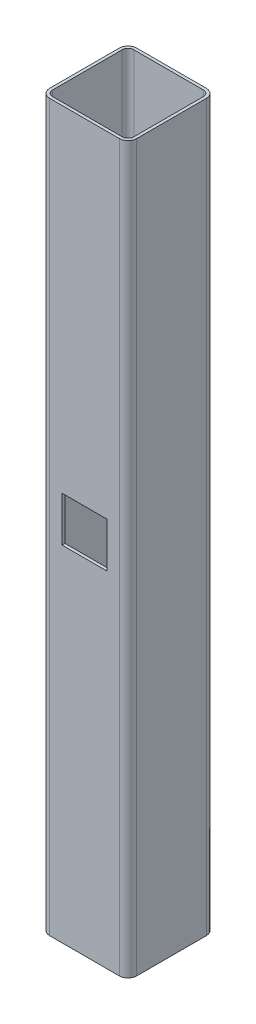
ISO-10303-21;
HEADER;
FILE_DESCRIPTION(('STEP AP214'),'2;1');
FILE_NAME('part.step','',(''),(''),'','','');
FILE_SCHEMA(('AUTOMOTIVE_DESIGN { 1 0 10303 214 1 1 1 1 }'));
ENDSEC;
DATA;
#1=APPLICATION_CONTEXT('core data for automotive mechanical design processes');
#2=APPLICATION_PROTOCOL_DEFINITION('international standard','automotive_design',2000,#1);
#3=PRODUCT_CONTEXT('',#1,'mechanical');
#4=PRODUCT('Part','Part','',(#3));
#5=PRODUCT_RELATED_PRODUCT_CATEGORY('part','',(#4));
#6=PRODUCT_DEFINITION_FORMATION('','',#4);
#7=PRODUCT_DEFINITION_CONTEXT('part definition',#1,'design');
#8=PRODUCT_DEFINITION('design','',#6,#7);
#9=PRODUCT_DEFINITION_SHAPE('','',#8);
#10=(LENGTH_UNIT() NAMED_UNIT(*) SI_UNIT(.MILLI.,.METRE.));
#11=(NAMED_UNIT(*) PLANE_ANGLE_UNIT() SI_UNIT($,.RADIAN.));
#12=(NAMED_UNIT(*) SI_UNIT($,.STERADIAN.) SOLID_ANGLE_UNIT());
#13=UNCERTAINTY_MEASURE_WITH_UNIT(LENGTH_MEASURE(1.E-05),#10,'distance_accuracy_value','');
#14=(GEOMETRIC_REPRESENTATION_CONTEXT(3) GLOBAL_UNCERTAINTY_ASSIGNED_CONTEXT((#13)) GLOBAL_UNIT_ASSIGNED_CONTEXT((#10,
#11,#12)) REPRESENTATION_CONTEXT('',''));
#15=CARTESIAN_POINT('',(0.,0.,0.));
#16=DIRECTION('',(0.,0.,1.));
#17=DIRECTION('',(1.,0.,0.));
#18=AXIS2_PLACEMENT_3D('',#15,#16,#17);
#19=CARTESIAN_POINT('',(24.,250.,24.));
#20=DIRECTION('',(0.,-1.,0.));
#21=DIRECTION('',(0.,0.,-1.));
#22=AXIS2_PLACEMENT_3D('',#19,#20,#21);
#23=PLANE('',#22);
#24=CARTESIAN_POINT('',(24.,250.,24.));
#25=DIRECTION('',(0.,1.,0.));
#26=DIRECTION('',(0.,0.,-1.));
#27=AXIS2_PLACEMENT_3D('',#24,#25,#26);
#28=CIRCLE('',#27,6.);
#29=CARTESIAN_POINT('',(24.,250.,30.));
#30=VERTEX_POINT('',#29);
#31=CARTESIAN_POINT('',(30.,250.,24.));
#32=VERTEX_POINT('',#31);
#33=EDGE_CURVE('E322',#30,#32,#28,.T.);
#34=ORIENTED_EDGE('',*,*,#33,.T.);
#35=DIRECTION('',(0.,0.,-1.));
#36=VECTOR('',#35,1.);
#37=CARTESIAN_POINT('',(30.,250.,24.));
#38=LINE('',#37,#36);
#39=CARTESIAN_POINT('',(30.,250.,-24.));
#40=VERTEX_POINT('',#39);
#41=EDGE_CURVE('E325',#32,#40,#38,.T.);
#42=ORIENTED_EDGE('',*,*,#41,.T.);
#43=CARTESIAN_POINT('',(24.,250.,-24.));
#44=DIRECTION('',(0.,1.,0.));
#45=DIRECTION('',(0.,0.,1.));
#46=AXIS2_PLACEMENT_3D('',#43,#44,#45);
#47=CIRCLE('',#46,6.);
#48=CARTESIAN_POINT('',(24.,250.,-30.));
#49=VERTEX_POINT('',#48);
#50=EDGE_CURVE('E328',#40,#49,#47,.T.);
#51=ORIENTED_EDGE('',*,*,#50,.T.);
#52=DIRECTION('',(-1.,0.,0.));
#53=VECTOR('',#52,1.);
#54=CARTESIAN_POINT('',(-24.,250.,-30.));
#55=LINE('',#54,#53);
#56=CARTESIAN_POINT('',(-24.,250.,-30.));
#57=VERTEX_POINT('',#56);
#58=EDGE_CURVE('E330',#49,#57,#55,.T.);
#59=ORIENTED_EDGE('',*,*,#58,.T.);
#60=CARTESIAN_POINT('',(-24.,250.,-24.));
#61=DIRECTION('',(0.,1.,0.));
#62=DIRECTION('',(0.,0.,1.));
#63=AXIS2_PLACEMENT_3D('',#60,#61,#62);
#64=CIRCLE('',#63,6.);
#65=CARTESIAN_POINT('',(-30.,250.,-24.));
#66=VERTEX_POINT('',#65);
#67=EDGE_CURVE('E332',#57,#66,#64,.T.);
#68=ORIENTED_EDGE('',*,*,#67,.T.);
#69=DIRECTION('',(0.,0.,1.));
#70=VECTOR('',#69,1.);
#71=CARTESIAN_POINT('',(-30.,250.,24.));
#72=LINE('',#71,#70);
#73=CARTESIAN_POINT('',(-30.,250.,24.));
#74=VERTEX_POINT('',#73);
#75=EDGE_CURVE('E334',#66,#74,#72,.T.);
#76=ORIENTED_EDGE('',*,*,#75,.T.);
#77=CARTESIAN_POINT('',(-24.,250.,24.));
#78=DIRECTION('',(0.,1.,0.));
#79=DIRECTION('',(0.,0.,-1.));
#80=AXIS2_PLACEMENT_3D('',#77,#78,#79);
#81=CIRCLE('',#80,6.);
#82=CARTESIAN_POINT('',(-24.,250.,30.));
#83=VERTEX_POINT('',#82);
#84=EDGE_CURVE('E336',#74,#83,#81,.T.);
#85=ORIENTED_EDGE('',*,*,#84,.T.);
#86=DIRECTION('',(1.,0.,0.));
#87=VECTOR('',#86,1.);
#88=CARTESIAN_POINT('',(-24.,250.,30.));
#89=LINE('',#88,#87);
#90=EDGE_CURVE('E338',#83,#30,#89,.T.);
#91=ORIENTED_EDGE('',*,*,#90,.T.);
#92=EDGE_LOOP('',(#34,#42,#51,#59,#68,#76,#85,#91));
#93=FACE_BOUND('',#92,.T.);
#94=CARTESIAN_POINT('',(24.,250.,24.));
#95=DIRECTION('',(0.,-1.,0.));
#96=DIRECTION('',(0.,0.,-1.));
#97=AXIS2_PLACEMENT_3D('',#94,#95,#96);
#98=CIRCLE('',#97,4.);
#99=CARTESIAN_POINT('',(24.,250.,28.));
#100=VERTEX_POINT('',#99);
#101=CARTESIAN_POINT('',(28.,250.,24.));
#102=VERTEX_POINT('',#101);
#103=EDGE_CURVE('E289',#100,#102,#98,.F.);
#104=ORIENTED_EDGE('',*,*,#103,.F.);
#105=DIRECTION('',(1.,0.,0.));
#106=VECTOR('',#105,1.);
#107=CARTESIAN_POINT('',(24.,250.,28.));
#108=LINE('',#107,#106);
#109=CARTESIAN_POINT('',(-24.,250.,28.));
#110=VERTEX_POINT('',#109);
#111=EDGE_CURVE('E271',#110,#100,#108,.T.);
#112=ORIENTED_EDGE('',*,*,#111,.F.);
#113=CARTESIAN_POINT('',(-24.,250.,24.));
#114=DIRECTION('',(0.,-1.,0.));
#115=DIRECTION('',(0.,0.,-1.));
#116=AXIS2_PLACEMENT_3D('',#113,#114,#115);
#117=CIRCLE('',#116,4.);
#118=CARTESIAN_POINT('',(-28.,250.,24.));
#119=VERTEX_POINT('',#118);
#120=EDGE_CURVE('E318',#119,#110,#117,.F.);
#121=ORIENTED_EDGE('',*,*,#120,.F.);
#122=DIRECTION('',(0.,0.,1.));
#123=VECTOR('',#122,1.);
#124=CARTESIAN_POINT('',(-28.,250.,24.));
#125=LINE('',#124,#123);
#126=CARTESIAN_POINT('',(-28.,250.,-24.));
#127=VERTEX_POINT('',#126);
#128=EDGE_CURVE('E316',#127,#119,#125,.T.);
#129=ORIENTED_EDGE('',*,*,#128,.F.);
#130=CARTESIAN_POINT('',(-24.,250.,-24.));
#131=DIRECTION('',(0.,-1.,0.));
#132=DIRECTION('',(0.,0.,-1.));
#133=AXIS2_PLACEMENT_3D('',#130,#131,#132);
#134=CIRCLE('',#133,4.);
#135=CARTESIAN_POINT('',(-24.,250.,-28.));
#136=VERTEX_POINT('',#135);
#137=EDGE_CURVE('E314',#136,#127,#134,.F.);
#138=ORIENTED_EDGE('',*,*,#137,.F.);
#139=DIRECTION('',(-1.,0.,0.));
#140=VECTOR('',#139,1.);
#141=CARTESIAN_POINT('',(24.,250.,-28.));
#142=LINE('',#141,#140);
#143=CARTESIAN_POINT('',(24.,250.,-28.));
#144=VERTEX_POINT('',#143);
#145=EDGE_CURVE('E312',#144,#136,#142,.T.);
#146=ORIENTED_EDGE('',*,*,#145,.F.);
#147=CARTESIAN_POINT('',(24.,250.,-24.));
#148=DIRECTION('',(0.,-1.,0.));
#149=DIRECTION('',(0.,0.,-1.));
#150=AXIS2_PLACEMENT_3D('',#147,#148,#149);
#151=CIRCLE('',#150,4.);
#152=CARTESIAN_POINT('',(28.,250.,-24.));
#153=VERTEX_POINT('',#152);
#154=EDGE_CURVE('E310',#153,#144,#151,.F.);
#155=ORIENTED_EDGE('',*,*,#154,.F.);
#156=DIRECTION('',(0.,0.,-1.));
#157=VECTOR('',#156,1.);
#158=CARTESIAN_POINT('',(28.,250.,24.));
#159=LINE('',#158,#157);
#160=EDGE_CURVE('E308',#102,#153,#159,.T.);
#161=ORIENTED_EDGE('',*,*,#160,.F.);
#162=EDGE_LOOP('',(#104,#112,#121,#129,#138,#146,#155,#161));
#163=FACE_BOUND('',#162,.T.);
#164=ADVANCED_FACE('F46',(#93,#163),#23,.F.);
#165=CARTESIAN_POINT('',(24.,-250.,24.));
#166=DIRECTION('',(0.,-1.,0.));
#167=DIRECTION('',(0.,0.,-1.));
#168=AXIS2_PLACEMENT_3D('',#165,#166,#167);
#169=PLANE('',#168);
#170=CARTESIAN_POINT('',(24.,-250.,24.));
#171=DIRECTION('',(0.,1.,0.));
#172=DIRECTION('',(0.,0.,-1.));
#173=AXIS2_PLACEMENT_3D('',#170,#171,#172);
#174=CIRCLE('',#173,6.);
#175=CARTESIAN_POINT('',(24.,-250.,30.));
#176=VERTEX_POINT('',#175);
#177=CARTESIAN_POINT('',(30.,-250.,24.));
#178=VERTEX_POINT('',#177);
#179=EDGE_CURVE('E266',#176,#178,#174,.T.);
#180=ORIENTED_EDGE('',*,*,#179,.F.);
#181=DIRECTION('',(1.,0.,0.));
#182=VECTOR('',#181,1.);
#183=CARTESIAN_POINT('',(-24.,-250.,30.));
#184=LINE('',#183,#182);
#185=CARTESIAN_POINT('',(-24.,-250.,30.));
#186=VERTEX_POINT('',#185);
#187=EDGE_CURVE('E326',#186,#176,#184,.T.);
#188=ORIENTED_EDGE('',*,*,#187,.F.);
#189=CARTESIAN_POINT('',(-24.,-250.,24.));
#190=DIRECTION('',(0.,1.,0.));
#191=DIRECTION('',(0.,0.,-1.));
#192=AXIS2_PLACEMENT_3D('',#189,#190,#191);
#193=CIRCLE('',#192,6.);
#194=CARTESIAN_POINT('',(-30.,-250.,24.));
#195=VERTEX_POINT('',#194);
#196=EDGE_CURVE('E353',#195,#186,#193,.T.);
#197=ORIENTED_EDGE('',*,*,#196,.F.);
#198=DIRECTION('',(0.,0.,1.));
#199=VECTOR('',#198,1.);
#200=CARTESIAN_POINT('',(-30.,-250.,24.));
#201=LINE('',#200,#199);
#202=CARTESIAN_POINT('',(-30.,-250.,-24.));
#203=VERTEX_POINT('',#202);
#204=EDGE_CURVE('E351',#203,#195,#201,.T.);
#205=ORIENTED_EDGE('',*,*,#204,.F.);
#206=CARTESIAN_POINT('',(-24.,-250.,-24.));
#207=DIRECTION('',(0.,1.,0.));
#208=DIRECTION('',(0.,0.,1.));
#209=AXIS2_PLACEMENT_3D('',#206,#207,#208);
#210=CIRCLE('',#209,6.);
#211=CARTESIAN_POINT('',(-24.,-250.,-30.));
#212=VERTEX_POINT('',#211);
#213=EDGE_CURVE('E349',#212,#203,#210,.T.);
#214=ORIENTED_EDGE('',*,*,#213,.F.);
#215=DIRECTION('',(-1.,0.,0.));
#216=VECTOR('',#215,1.);
#217=CARTESIAN_POINT('',(-24.,-250.,-30.));
#218=LINE('',#217,#216);
#219=CARTESIAN_POINT('',(24.,-250.,-30.));
#220=VERTEX_POINT('',#219);
#221=EDGE_CURVE('E347',#220,#212,#218,.T.);
#222=ORIENTED_EDGE('',*,*,#221,.F.);
#223=CARTESIAN_POINT('',(24.,-250.,-24.));
#224=DIRECTION('',(0.,1.,0.));
#225=DIRECTION('',(0.,0.,1.));
#226=AXIS2_PLACEMENT_3D('',#223,#224,#225);
#227=CIRCLE('',#226,6.);
#228=CARTESIAN_POINT('',(30.,-250.,-24.));
#229=VERTEX_POINT('',#228);
#230=EDGE_CURVE('E345',#229,#220,#227,.T.);
#231=ORIENTED_EDGE('',*,*,#230,.F.);
#232=DIRECTION('',(0.,0.,-1.));
#233=VECTOR('',#232,1.);
#234=CARTESIAN_POINT('',(30.,-250.,24.));
#235=LINE('',#234,#233);
#236=EDGE_CURVE('E343',#178,#229,#235,.T.);
#237=ORIENTED_EDGE('',*,*,#236,.F.);
#238=EDGE_LOOP('',(#180,#188,#197,#205,#214,#222,#231,#237));
#239=FACE_BOUND('',#238,.T.);
#240=DIRECTION('',(1.,0.,0.));
#241=VECTOR('',#240,1.);
#242=CARTESIAN_POINT('',(24.,-250.,28.));
#243=LINE('',#242,#241);
#244=CARTESIAN_POINT('',(-24.,-250.,28.));
#245=VERTEX_POINT('',#244);
#246=CARTESIAN_POINT('',(24.,-250.,28.));
#247=VERTEX_POINT('',#246);
#248=EDGE_CURVE('E286',#245,#247,#243,.T.);
#249=ORIENTED_EDGE('',*,*,#248,.T.);
#250=CARTESIAN_POINT('',(24.,-250.,24.));
#251=DIRECTION('',(0.,-1.,0.));
#252=DIRECTION('',(0.,0.,-1.));
#253=AXIS2_PLACEMENT_3D('',#250,#251,#252);
#254=CIRCLE('',#253,4.);
#255=CARTESIAN_POINT('',(28.,-250.,24.));
#256=VERTEX_POINT('',#255);
#257=EDGE_CURVE('E262',#247,#256,#254,.F.);
#258=ORIENTED_EDGE('',*,*,#257,.T.);
#259=DIRECTION('',(0.,0.,-1.));
#260=VECTOR('',#259,1.);
#261=CARTESIAN_POINT('',(28.,-250.,24.));
#262=LINE('',#261,#260);
#263=CARTESIAN_POINT('',(28.,-250.,-24.));
#264=VERTEX_POINT('',#263);
#265=EDGE_CURVE('E285',#256,#264,#262,.T.);
#266=ORIENTED_EDGE('',*,*,#265,.T.);
#267=CARTESIAN_POINT('',(24.,-250.,-24.));
#268=DIRECTION('',(0.,-1.,0.));
#269=DIRECTION('',(0.,0.,-1.));
#270=AXIS2_PLACEMENT_3D('',#267,#268,#269);
#271=CIRCLE('',#270,4.);
#272=CARTESIAN_POINT('',(24.,-250.,-28.));
#273=VERTEX_POINT('',#272);
#274=EDGE_CURVE('E302',#264,#273,#271,.F.);
#275=ORIENTED_EDGE('',*,*,#274,.T.);
#276=DIRECTION('',(-1.,0.,0.));
#277=VECTOR('',#276,1.);
#278=CARTESIAN_POINT('',(24.,-250.,-28.));
#279=LINE('',#278,#277);
#280=CARTESIAN_POINT('',(-24.,-250.,-28.));
#281=VERTEX_POINT('',#280);
#282=EDGE_CURVE('E299',#273,#281,#279,.T.);
#283=ORIENTED_EDGE('',*,*,#282,.T.);
#284=CARTESIAN_POINT('',(-24.,-250.,-24.));
#285=DIRECTION('',(0.,-1.,0.));
#286=DIRECTION('',(0.,0.,-1.));
#287=AXIS2_PLACEMENT_3D('',#284,#285,#286);
#288=CIRCLE('',#287,4.);
#289=CARTESIAN_POINT('',(-28.,-250.,-24.));
#290=VERTEX_POINT('',#289);
#291=EDGE_CURVE('E296',#281,#290,#288,.F.);
#292=ORIENTED_EDGE('',*,*,#291,.T.);
#293=DIRECTION('',(0.,0.,1.));
#294=VECTOR('',#293,1.);
#295=CARTESIAN_POINT('',(-28.,-250.,24.));
#296=LINE('',#295,#294);
#297=CARTESIAN_POINT('',(-28.,-250.,24.));
#298=VERTEX_POINT('',#297);
#299=EDGE_CURVE('E293',#290,#298,#296,.T.);
#300=ORIENTED_EDGE('',*,*,#299,.T.);
#301=CARTESIAN_POINT('',(-24.,-250.,24.));
#302=DIRECTION('',(0.,-1.,0.));
#303=DIRECTION('',(0.,0.,-1.));
#304=AXIS2_PLACEMENT_3D('',#301,#302,#303);
#305=CIRCLE('',#304,4.);
#306=EDGE_CURVE('E290',#298,#245,#305,.F.);
#307=ORIENTED_EDGE('',*,*,#306,.T.);
#308=EDGE_LOOP('',(#249,#258,#266,#275,#283,#292,#300,#307));
#309=FACE_BOUND('',#308,.T.);
#310=ADVANCED_FACE('F404',(#239,#309),#169,.T.);
#311=CARTESIAN_POINT('',(24.,250.,24.));
#312=DIRECTION('',(0.,-1.,0.));
#313=DIRECTION('',(0.,0.,-1.));
#314=AXIS2_PLACEMENT_3D('',#311,#312,#313);
#315=CYLINDRICAL_SURFACE('',#314,6.);
#316=ORIENTED_EDGE('',*,*,#179,.T.);
#317=DIRECTION('',(0.,-1.,0.));
#318=VECTOR('',#317,1.);
#319=CARTESIAN_POINT('',(30.,250.,24.));
#320=LINE('',#319,#318);
#321=EDGE_CURVE('E376',#32,#178,#320,.T.);
#322=ORIENTED_EDGE('',*,*,#321,.F.);
#323=ORIENTED_EDGE('',*,*,#33,.F.);
#324=DIRECTION('',(0.,-1.,0.));
#325=VECTOR('',#324,1.);
#326=CARTESIAN_POINT('',(24.,250.,30.));
#327=LINE('',#326,#325);
#328=EDGE_CURVE('E340',#30,#176,#327,.T.);
#329=ORIENTED_EDGE('',*,*,#328,.T.);
#330=EDGE_LOOP('',(#316,#322,#323,#329));
#331=FACE_BOUND('',#330,.T.);
#332=ADVANCED_FACE('F48',(#331),#315,.T.);
#333=CARTESIAN_POINT('',(30.,250.,24.));
#334=DIRECTION('',(-1.,0.,0.));
#335=DIRECTION('',(0.,0.,1.));
#336=AXIS2_PLACEMENT_3D('',#333,#334,#335);
#337=PLANE('',#336);
#338=ORIENTED_EDGE('',*,*,#236,.T.);
#339=DIRECTION('',(0.,-1.,0.));
#340=VECTOR('',#339,1.);
#341=CARTESIAN_POINT('',(30.,250.,-24.));
#342=LINE('',#341,#340);
#343=EDGE_CURVE('E373',#40,#229,#342,.T.);
#344=ORIENTED_EDGE('',*,*,#343,.F.);
#345=ORIENTED_EDGE('',*,*,#41,.F.);
#346=ORIENTED_EDGE('',*,*,#321,.T.);
#347=EDGE_LOOP('',(#338,#344,#345,#346));
#348=FACE_BOUND('',#347,.T.);
#349=ADVANCED_FACE('F437',(#348),#337,.F.);
#350=CARTESIAN_POINT('',(24.,250.,-24.));
#351=DIRECTION('',(0.,-1.,0.));
#352=DIRECTION('',(0.,0.,-1.));
#353=AXIS2_PLACEMENT_3D('',#350,#351,#352);
#354=CYLINDRICAL_SURFACE('',#353,6.);
#355=ORIENTED_EDGE('',*,*,#230,.T.);
#356=DIRECTION('',(0.,-1.,0.));
#357=VECTOR('',#356,1.);
#358=CARTESIAN_POINT('',(24.,250.,-30.));
#359=LINE('',#358,#357);
#360=EDGE_CURVE('E370',#49,#220,#359,.T.);
#361=ORIENTED_EDGE('',*,*,#360,.F.);
#362=ORIENTED_EDGE('',*,*,#50,.F.);
#363=ORIENTED_EDGE('',*,*,#343,.T.);
#364=EDGE_LOOP('',(#355,#361,#362,#363));
#365=FACE_BOUND('',#364,.T.);
#366=ADVANCED_FACE('F434',(#365),#354,.T.);
#367=CARTESIAN_POINT('',(-24.,250.,-30.));
#368=DIRECTION('',(0.,0.,1.));
#369=DIRECTION('',(1.,0.,0.));
#370=AXIS2_PLACEMENT_3D('',#367,#368,#369);
#371=PLANE('',#370);
#372=DIRECTION('',(1.,0.,0.));
#373=VECTOR('',#372,1.);
#374=CARTESIAN_POINT('',(15.5,18.5021472218207,-30.));
#375=LINE('',#374,#373);
#376=CARTESIAN_POINT('',(-15.5,18.5021472218207,-30.));
#377=VERTEX_POINT('',#376);
#378=CARTESIAN_POINT('',(15.5,18.5021472218207,-30.));
#379=VERTEX_POINT('',#378);
#380=EDGE_CURVE('E240',#377,#379,#375,.T.);
#381=ORIENTED_EDGE('',*,*,#380,.F.);
#382=DIRECTION('',(0.,1.,0.));
#383=VECTOR('',#382,1.);
#384=CARTESIAN_POINT('',(-15.5,18.5021472218207,-30.));
#385=LINE('',#384,#383);
#386=CARTESIAN_POINT('',(-15.5,-12.4978527781793,-30.));
#387=VERTEX_POINT('',#386);
#388=EDGE_CURVE('E61',#387,#377,#385,.T.);
#389=ORIENTED_EDGE('',*,*,#388,.F.);
#390=DIRECTION('',(-1.,0.,0.));
#391=VECTOR('',#390,1.);
#392=CARTESIAN_POINT('',(15.5,-12.4978527781793,-30.));
#393=LINE('',#392,#391);
#394=CARTESIAN_POINT('',(15.5,-12.4978527781793,-30.));
#395=VERTEX_POINT('',#394);
#396=EDGE_CURVE('E231',#395,#387,#393,.T.);
#397=ORIENTED_EDGE('',*,*,#396,.F.);
#398=DIRECTION('',(0.,-1.,0.));
#399=VECTOR('',#398,1.);
#400=CARTESIAN_POINT('',(15.5,18.5021472218207,-30.));
#401=LINE('',#400,#399);
#402=EDGE_CURVE('E234',#379,#395,#401,.T.);
#403=ORIENTED_EDGE('',*,*,#402,.F.);
#404=EDGE_LOOP('',(#381,#389,#397,#403));
#405=FACE_BOUND('',#404,.T.);
#406=ORIENTED_EDGE('',*,*,#221,.T.);
#407=DIRECTION('',(0.,-1.,0.));
#408=VECTOR('',#407,1.);
#409=CARTESIAN_POINT('',(-24.,250.,-30.));
#410=LINE('',#409,#408);
#411=EDGE_CURVE('E367',#57,#212,#410,.T.);
#412=ORIENTED_EDGE('',*,*,#411,.F.);
#413=ORIENTED_EDGE('',*,*,#58,.F.);
#414=ORIENTED_EDGE('',*,*,#360,.T.);
#415=EDGE_LOOP('',(#406,#412,#413,#414));
#416=FACE_BOUND('',#415,.T.);
#417=ADVANCED_FACE('F430',(#405,#416),#371,.F.);
#418=CARTESIAN_POINT('',(-24.,250.,-24.));
#419=DIRECTION('',(0.,-1.,0.));
#420=DIRECTION('',(0.,0.,-1.));
#421=AXIS2_PLACEMENT_3D('',#418,#419,#420);
#422=CYLINDRICAL_SURFACE('',#421,6.);
#423=ORIENTED_EDGE('',*,*,#213,.T.);
#424=DIRECTION('',(0.,-1.,0.));
#425=VECTOR('',#424,1.);
#426=CARTESIAN_POINT('',(-30.,250.,-24.));
#427=LINE('',#426,#425);
#428=EDGE_CURVE('E364',#66,#203,#427,.T.);
#429=ORIENTED_EDGE('',*,*,#428,.F.);
#430=ORIENTED_EDGE('',*,*,#67,.F.);
#431=ORIENTED_EDGE('',*,*,#411,.T.);
#432=EDGE_LOOP('',(#423,#429,#430,#431));
#433=FACE_BOUND('',#432,.T.);
#434=ADVANCED_FACE('F426',(#433),#422,.T.);
#435=CARTESIAN_POINT('',(-30.,250.,24.));
#436=DIRECTION('',(1.,0.,0.));
#437=DIRECTION('',(0.,0.,-1.));
#438=AXIS2_PLACEMENT_3D('',#435,#436,#437);
#439=PLANE('',#438);
#440=ORIENTED_EDGE('',*,*,#204,.T.);
#441=DIRECTION('',(0.,-1.,0.));
#442=VECTOR('',#441,1.);
#443=CARTESIAN_POINT('',(-30.,250.,24.));
#444=LINE('',#443,#442);
#445=EDGE_CURVE('E361',#74,#195,#444,.T.);
#446=ORIENTED_EDGE('',*,*,#445,.F.);
#447=ORIENTED_EDGE('',*,*,#75,.F.);
#448=ORIENTED_EDGE('',*,*,#428,.T.);
#449=EDGE_LOOP('',(#440,#446,#447,#448));
#450=FACE_BOUND('',#449,.T.);
#451=ADVANCED_FACE('F422',(#450),#439,.F.);
#452=CARTESIAN_POINT('',(-24.,250.,24.));
#453=DIRECTION('',(0.,-1.,0.));
#454=DIRECTION('',(0.,0.,-1.));
#455=AXIS2_PLACEMENT_3D('',#452,#453,#454);
#456=CYLINDRICAL_SURFACE('',#455,6.);
#457=ORIENTED_EDGE('',*,*,#196,.T.);
#458=DIRECTION('',(0.,-1.,0.));
#459=VECTOR('',#458,1.);
#460=CARTESIAN_POINT('',(-24.,250.,30.));
#461=LINE('',#460,#459);
#462=EDGE_CURVE('E358',#83,#186,#461,.T.);
#463=ORIENTED_EDGE('',*,*,#462,.F.);
#464=ORIENTED_EDGE('',*,*,#84,.F.);
#465=ORIENTED_EDGE('',*,*,#445,.T.);
#466=EDGE_LOOP('',(#457,#463,#464,#465));
#467=FACE_BOUND('',#466,.T.);
#468=ADVANCED_FACE('F419',(#467),#456,.T.);
#469=CARTESIAN_POINT('',(-24.,250.,30.));
#470=DIRECTION('',(0.,0.,-1.));
#471=DIRECTION('',(-1.,0.,0.));
#472=AXIS2_PLACEMENT_3D('',#469,#470,#471);
#473=PLANE('',#472);
#474=DIRECTION('',(-1.,0.,0.));
#475=VECTOR('',#474,1.);
#476=CARTESIAN_POINT('',(15.5,-12.4978527781793,30.));
#477=LINE('',#476,#475);
#478=CARTESIAN_POINT('',(15.5,-12.4978527781793,30.));
#479=VERTEX_POINT('',#478);
#480=CARTESIAN_POINT('',(-15.5,-12.4978527781793,30.));
#481=VERTEX_POINT('',#480);
#482=EDGE_CURVE('E230',#479,#481,#477,.T.);
#483=ORIENTED_EDGE('',*,*,#482,.T.);
#484=DIRECTION('',(0.,1.,0.));
#485=VECTOR('',#484,1.);
#486=CARTESIAN_POINT('',(-15.5,18.5021472218207,30.));
#487=LINE('',#486,#485);
#488=CARTESIAN_POINT('',(-15.5,18.5021472218207,30.));
#489=VERTEX_POINT('',#488);
#490=EDGE_CURVE('E213',#481,#489,#487,.T.);
#491=ORIENTED_EDGE('',*,*,#490,.T.);
#492=DIRECTION('',(1.,0.,0.));
#493=VECTOR('',#492,1.);
#494=CARTESIAN_POINT('',(15.5,18.5021472218207,30.));
#495=LINE('',#494,#493);
#496=CARTESIAN_POINT('',(15.5,18.5021472218207,30.));
#497=VERTEX_POINT('',#496);
#498=EDGE_CURVE('E222',#489,#497,#495,.T.);
#499=ORIENTED_EDGE('',*,*,#498,.T.);
#500=DIRECTION('',(0.,-1.,0.));
#501=VECTOR('',#500,1.);
#502=CARTESIAN_POINT('',(15.5,18.5021472218207,30.));
#503=LINE('',#502,#501);
#504=EDGE_CURVE('E69',#497,#479,#503,.T.);
#505=ORIENTED_EDGE('',*,*,#504,.T.);
#506=EDGE_LOOP('',(#483,#491,#499,#505));
#507=FACE_BOUND('',#506,.T.);
#508=ORIENTED_EDGE('',*,*,#187,.T.);
#509=ORIENTED_EDGE('',*,*,#328,.F.);
#510=ORIENTED_EDGE('',*,*,#90,.F.);
#511=ORIENTED_EDGE('',*,*,#462,.T.);
#512=EDGE_LOOP('',(#508,#509,#510,#511));
#513=FACE_BOUND('',#512,.T.);
#514=ADVANCED_FACE('F227',(#507,#513),#473,.F.);
#515=CARTESIAN_POINT('',(24.,250.,24.));
#516=DIRECTION('',(0.,-1.,0.));
#517=DIRECTION('',(0.,0.,-1.));
#518=AXIS2_PLACEMENT_3D('',#515,#516,#517);
#519=CYLINDRICAL_SURFACE('',#518,4.);
#520=ORIENTED_EDGE('',*,*,#257,.F.);
#521=DIRECTION('',(0.,-1.,0.));
#522=VECTOR('',#521,1.);
#523=CARTESIAN_POINT('',(24.,250.,28.));
#524=LINE('',#523,#522);
#525=EDGE_CURVE('E268',#100,#247,#524,.T.);
#526=ORIENTED_EDGE('',*,*,#525,.F.);
#527=ORIENTED_EDGE('',*,*,#103,.T.);
#528=DIRECTION('',(0.,1.,0.));
#529=VECTOR('',#528,1.);
#530=CARTESIAN_POINT('',(28.,250.,24.));
#531=LINE('',#530,#529);
#532=EDGE_CURVE('E263',#102,#256,#531,.F.);
#533=ORIENTED_EDGE('',*,*,#532,.T.);
#534=EDGE_LOOP('',(#520,#526,#527,#533));
#535=FACE_BOUND('',#534,.T.);
#536=ADVANCED_FACE('F418',(#535),#519,.F.);
#537=CARTESIAN_POINT('',(28.,250.,24.));
#538=DIRECTION('',(-1.,0.,0.));
#539=DIRECTION('',(0.,0.,1.));
#540=AXIS2_PLACEMENT_3D('',#537,#538,#539);
#541=PLANE('',#540);
#542=ORIENTED_EDGE('',*,*,#265,.F.);
#543=ORIENTED_EDGE('',*,*,#532,.F.);
#544=ORIENTED_EDGE('',*,*,#160,.T.);
#545=DIRECTION('',(0.,-1.,0.));
#546=VECTOR('',#545,1.);
#547=CARTESIAN_POINT('',(28.,250.,-24.));
#548=LINE('',#547,#546);
#549=EDGE_CURVE('E267',#153,#264,#548,.T.);
#550=ORIENTED_EDGE('',*,*,#549,.T.);
#551=EDGE_LOOP('',(#542,#543,#544,#550));
#552=FACE_BOUND('',#551,.T.);
#553=ADVANCED_FACE('F479',(#552),#541,.T.);
#554=CARTESIAN_POINT('',(24.,250.,-24.));
#555=DIRECTION('',(0.,-1.,0.));
#556=DIRECTION('',(0.,0.,-1.));
#557=AXIS2_PLACEMENT_3D('',#554,#555,#556);
#558=CYLINDRICAL_SURFACE('',#557,4.);
#559=ORIENTED_EDGE('',*,*,#274,.F.);
#560=ORIENTED_EDGE('',*,*,#549,.F.);
#561=ORIENTED_EDGE('',*,*,#154,.T.);
#562=DIRECTION('',(0.,1.,0.));
#563=VECTOR('',#562,1.);
#564=CARTESIAN_POINT('',(24.,250.,-28.));
#565=LINE('',#564,#563);
#566=EDGE_CURVE('E274',#144,#273,#565,.F.);
#567=ORIENTED_EDGE('',*,*,#566,.T.);
#568=EDGE_LOOP('',(#559,#560,#561,#567));
#569=FACE_BOUND('',#568,.T.);
#570=ADVANCED_FACE('F486',(#569),#558,.F.);
#571=CARTESIAN_POINT('',(-24.,250.,-28.));
#572=DIRECTION('',(0.,0.,1.));
#573=DIRECTION('',(1.,0.,0.));
#574=AXIS2_PLACEMENT_3D('',#571,#572,#573);
#575=PLANE('',#574);
#576=DIRECTION('',(0.,-1.,0.));
#577=VECTOR('',#576,1.);
#578=CARTESIAN_POINT('',(-15.5,250.,-28.));
#579=LINE('',#578,#577);
#580=CARTESIAN_POINT('',(-15.5,18.5021472218207,-28.));
#581=VERTEX_POINT('',#580);
#582=CARTESIAN_POINT('',(-15.5,-12.4978527781793,-28.));
#583=VERTEX_POINT('',#582);
#584=EDGE_CURVE('E260',#581,#583,#579,.T.);
#585=ORIENTED_EDGE('',*,*,#584,.F.);
#586=DIRECTION('',(-1.,0.,0.));
#587=VECTOR('',#586,1.);
#588=CARTESIAN_POINT('',(-24.,18.5021472218207,-28.));
#589=LINE('',#588,#587);
#590=CARTESIAN_POINT('',(15.5,18.5021472218207,-28.));
#591=VERTEX_POINT('',#590);
#592=EDGE_CURVE('E247',#591,#581,#589,.T.);
#593=ORIENTED_EDGE('',*,*,#592,.F.);
#594=DIRECTION('',(0.,1.,0.));
#595=VECTOR('',#594,1.);
#596=CARTESIAN_POINT('',(15.5,250.,-28.));
#597=LINE('',#596,#595);
#598=CARTESIAN_POINT('',(15.5,-12.4978527781793,-28.));
#599=VERTEX_POINT('',#598);
#600=EDGE_CURVE('E255',#599,#591,#597,.T.);
#601=ORIENTED_EDGE('',*,*,#600,.F.);
#602=DIRECTION('',(1.,0.,0.));
#603=VECTOR('',#602,1.);
#604=CARTESIAN_POINT('',(-24.,-12.4978527781793,-28.));
#605=LINE('',#604,#603);
#606=EDGE_CURVE('E258',#583,#599,#605,.T.);
#607=ORIENTED_EDGE('',*,*,#606,.F.);
#608=EDGE_LOOP('',(#585,#593,#601,#607));
#609=FACE_BOUND('',#608,.T.);
#610=ORIENTED_EDGE('',*,*,#282,.F.);
#611=ORIENTED_EDGE('',*,*,#566,.F.);
#612=ORIENTED_EDGE('',*,*,#145,.T.);
#613=DIRECTION('',(0.,-1.,0.));
#614=VECTOR('',#613,1.);
#615=CARTESIAN_POINT('',(-24.,250.,-28.));
#616=LINE('',#615,#614);
#617=EDGE_CURVE('E276',#136,#281,#616,.T.);
#618=ORIENTED_EDGE('',*,*,#617,.T.);
#619=EDGE_LOOP('',(#610,#611,#612,#618));
#620=FACE_BOUND('',#619,.T.);
#621=ADVANCED_FACE('F489',(#609,#620),#575,.T.);
#622=CARTESIAN_POINT('',(-24.,250.,-24.));
#623=DIRECTION('',(0.,-1.,0.));
#624=DIRECTION('',(0.,0.,-1.));
#625=AXIS2_PLACEMENT_3D('',#622,#623,#624);
#626=CYLINDRICAL_SURFACE('',#625,4.);
#627=ORIENTED_EDGE('',*,*,#291,.F.);
#628=ORIENTED_EDGE('',*,*,#617,.F.);
#629=ORIENTED_EDGE('',*,*,#137,.T.);
#630=DIRECTION('',(0.,1.,0.));
#631=VECTOR('',#630,1.);
#632=CARTESIAN_POINT('',(-28.,250.,-24.));
#633=LINE('',#632,#631);
#634=EDGE_CURVE('E278',#127,#290,#633,.F.);
#635=ORIENTED_EDGE('',*,*,#634,.T.);
#636=EDGE_LOOP('',(#627,#628,#629,#635));
#637=FACE_BOUND('',#636,.T.);
#638=ADVANCED_FACE('F494',(#637),#626,.F.);
#639=CARTESIAN_POINT('',(-28.,250.,24.));
#640=DIRECTION('',(1.,0.,0.));
#641=DIRECTION('',(0.,0.,-1.));
#642=AXIS2_PLACEMENT_3D('',#639,#640,#641);
#643=PLANE('',#642);
#644=ORIENTED_EDGE('',*,*,#299,.F.);
#645=ORIENTED_EDGE('',*,*,#634,.F.);
#646=ORIENTED_EDGE('',*,*,#128,.T.);
#647=DIRECTION('',(0.,-1.,0.));
#648=VECTOR('',#647,1.);
#649=CARTESIAN_POINT('',(-28.,250.,24.));
#650=LINE('',#649,#648);
#651=EDGE_CURVE('E280',#119,#298,#650,.T.);
#652=ORIENTED_EDGE('',*,*,#651,.T.);
#653=EDGE_LOOP('',(#644,#645,#646,#652));
#654=FACE_BOUND('',#653,.T.);
#655=ADVANCED_FACE('F498',(#654),#643,.T.);
#656=CARTESIAN_POINT('',(-24.,250.,24.));
#657=DIRECTION('',(0.,-1.,0.));
#658=DIRECTION('',(0.,0.,-1.));
#659=AXIS2_PLACEMENT_3D('',#656,#657,#658);
#660=CYLINDRICAL_SURFACE('',#659,4.);
#661=ORIENTED_EDGE('',*,*,#306,.F.);
#662=ORIENTED_EDGE('',*,*,#651,.F.);
#663=ORIENTED_EDGE('',*,*,#120,.T.);
#664=DIRECTION('',(0.,1.,0.));
#665=VECTOR('',#664,1.);
#666=CARTESIAN_POINT('',(-24.,250.,28.));
#667=LINE('',#666,#665);
#668=EDGE_CURVE('E270',#110,#245,#667,.F.);
#669=ORIENTED_EDGE('',*,*,#668,.T.);
#670=EDGE_LOOP('',(#661,#662,#663,#669));
#671=FACE_BOUND('',#670,.T.);
#672=ADVANCED_FACE('F502',(#671),#660,.F.);
#673=CARTESIAN_POINT('',(-24.,250.,28.));
#674=DIRECTION('',(0.,0.,-1.));
#675=DIRECTION('',(-1.,0.,0.));
#676=AXIS2_PLACEMENT_3D('',#673,#674,#675);
#677=PLANE('',#676);
#678=DIRECTION('',(0.,1.,0.));
#679=VECTOR('',#678,1.);
#680=CARTESIAN_POINT('',(-15.5,250.,28.));
#681=LINE('',#680,#679);
#682=CARTESIAN_POINT('',(-15.5,-12.4978527781793,28.));
#683=VERTEX_POINT('',#682);
#684=CARTESIAN_POINT('',(-15.5,18.5021472218207,28.));
#685=VERTEX_POINT('',#684);
#686=EDGE_CURVE('E13',#683,#685,#681,.T.);
#687=ORIENTED_EDGE('',*,*,#686,.F.);
#688=DIRECTION('',(-1.,0.,0.));
#689=VECTOR('',#688,1.);
#690=CARTESIAN_POINT('',(-24.,-12.4978527781793,28.));
#691=LINE('',#690,#689);
#692=CARTESIAN_POINT('',(15.5,-12.4978527781793,28.));
#693=VERTEX_POINT('',#692);
#694=EDGE_CURVE('E54',#693,#683,#691,.T.);
#695=ORIENTED_EDGE('',*,*,#694,.F.);
#696=DIRECTION('',(0.,-1.,0.));
#697=VECTOR('',#696,1.);
#698=CARTESIAN_POINT('',(15.5,250.,28.));
#699=LINE('',#698,#697);
#700=CARTESIAN_POINT('',(15.5,18.5021472218207,28.));
#701=VERTEX_POINT('',#700);
#702=EDGE_CURVE('E381',#701,#693,#699,.T.);
#703=ORIENTED_EDGE('',*,*,#702,.F.);
#704=DIRECTION('',(1.,0.,0.));
#705=VECTOR('',#704,1.);
#706=CARTESIAN_POINT('',(-24.,18.5021472218207,28.));
#707=LINE('',#706,#705);
#708=EDGE_CURVE('E379',#685,#701,#707,.T.);
#709=ORIENTED_EDGE('',*,*,#708,.F.);
#710=EDGE_LOOP('',(#687,#695,#703,#709));
#711=FACE_BOUND('',#710,.T.);
#712=ORIENTED_EDGE('',*,*,#248,.F.);
#713=ORIENTED_EDGE('',*,*,#668,.F.);
#714=ORIENTED_EDGE('',*,*,#111,.T.);
#715=ORIENTED_EDGE('',*,*,#525,.T.);
#716=EDGE_LOOP('',(#712,#713,#714,#715));
#717=FACE_BOUND('',#716,.T.);
#718=ADVANCED_FACE('F387',(#711,#717),#677,.T.);
#719=CARTESIAN_POINT('',(15.5,18.5021472218207,30.));
#720=DIRECTION('',(0.,1.,0.));
#721=DIRECTION('',(0.,0.,1.));
#722=AXIS2_PLACEMENT_3D('',#719,#720,#721);
#723=PLANE('',#722);
#724=ORIENTED_EDGE('',*,*,#708,.T.);
#725=DIRECTION('',(0.,0.,-1.));
#726=VECTOR('',#725,1.);
#727=CARTESIAN_POINT('',(15.5,18.5021472218207,30.));
#728=LINE('',#727,#726);
#729=EDGE_CURVE('E224',#497,#701,#728,.T.);
#730=ORIENTED_EDGE('',*,*,#729,.F.);
#731=ORIENTED_EDGE('',*,*,#498,.F.);
#732=DIRECTION('',(0.,0.,-1.));
#733=VECTOR('',#732,1.);
#734=CARTESIAN_POINT('',(-15.5,18.5021472218207,30.));
#735=LINE('',#734,#733);
#736=EDGE_CURVE('E208',#489,#685,#735,.T.);
#737=ORIENTED_EDGE('',*,*,#736,.T.);
#738=EDGE_LOOP('',(#724,#730,#731,#737));
#739=FACE_BOUND('',#738,.T.);
#740=ADVANCED_FACE('F223',(#739),#723,.F.);
#741=CARTESIAN_POINT('',(15.5,18.5021472218207,30.));
#742=DIRECTION('',(1.,0.,0.));
#743=DIRECTION('',(0.,1.,0.));
#744=AXIS2_PLACEMENT_3D('',#741,#742,#743);
#745=PLANE('',#744);
#746=ORIENTED_EDGE('',*,*,#702,.T.);
#747=DIRECTION('',(0.,0.,-1.));
#748=VECTOR('',#747,1.);
#749=CARTESIAN_POINT('',(15.5,-12.4978527781793,30.));
#750=LINE('',#749,#748);
#751=EDGE_CURVE('E249',#479,#693,#750,.T.);
#752=ORIENTED_EDGE('',*,*,#751,.F.);
#753=ORIENTED_EDGE('',*,*,#504,.F.);
#754=ORIENTED_EDGE('',*,*,#729,.T.);
#755=EDGE_LOOP('',(#746,#752,#753,#754));
#756=FACE_BOUND('',#755,.T.);
#757=ADVANCED_FACE('F389',(#756),#745,.F.);
#758=CARTESIAN_POINT('',(15.5,-12.4978527781793,30.));
#759=DIRECTION('',(0.,-1.,0.));
#760=DIRECTION('',(1.,0.,0.));
#761=AXIS2_PLACEMENT_3D('',#758,#759,#760);
#762=PLANE('',#761);
#763=ORIENTED_EDGE('',*,*,#694,.T.);
#764=DIRECTION('',(0.,0.,-1.));
#765=VECTOR('',#764,1.);
#766=CARTESIAN_POINT('',(-15.5,-12.4978527781793,30.));
#767=LINE('',#766,#765);
#768=EDGE_CURVE('E245',#481,#683,#767,.T.);
#769=ORIENTED_EDGE('',*,*,#768,.F.);
#770=ORIENTED_EDGE('',*,*,#482,.F.);
#771=ORIENTED_EDGE('',*,*,#751,.T.);
#772=EDGE_LOOP('',(#763,#769,#770,#771));
#773=FACE_BOUND('',#772,.T.);
#774=ADVANCED_FACE('F384',(#773),#762,.F.);
#775=CARTESIAN_POINT('',(-15.5,18.5021472218207,30.));
#776=DIRECTION('',(-1.,0.,0.));
#777=DIRECTION('',(0.,-1.,0.));
#778=AXIS2_PLACEMENT_3D('',#775,#776,#777);
#779=PLANE('',#778);
#780=ORIENTED_EDGE('',*,*,#686,.T.);
#781=ORIENTED_EDGE('',*,*,#736,.F.);
#782=ORIENTED_EDGE('',*,*,#490,.F.);
#783=ORIENTED_EDGE('',*,*,#768,.T.);
#784=EDGE_LOOP('',(#780,#781,#782,#783));
#785=FACE_BOUND('',#784,.T.);
#786=ADVANCED_FACE('F210',(#785),#779,.F.);
#787=ORIENTED_EDGE('',*,*,#584,.T.);
#788=EDGE_CURVE('E248',#583,#387,#767,.T.);
#789=ORIENTED_EDGE('',*,*,#788,.T.);
#790=ORIENTED_EDGE('',*,*,#388,.T.);
#791=EDGE_CURVE('E219',#581,#377,#735,.T.);
#792=ORIENTED_EDGE('',*,*,#791,.F.);
#793=EDGE_LOOP('',(#787,#789,#790,#792));
#794=FACE_BOUND('',#793,.T.);
#795=ADVANCED_FACE('F522',(#794),#779,.F.);
#796=ORIENTED_EDGE('',*,*,#606,.T.);
#797=EDGE_CURVE('E252',#599,#395,#750,.T.);
#798=ORIENTED_EDGE('',*,*,#797,.T.);
#799=ORIENTED_EDGE('',*,*,#396,.T.);
#800=ORIENTED_EDGE('',*,*,#788,.F.);
#801=EDGE_LOOP('',(#796,#798,#799,#800));
#802=FACE_BOUND('',#801,.T.);
#803=ADVANCED_FACE('F398',(#802),#762,.F.);
#804=ORIENTED_EDGE('',*,*,#600,.T.);
#805=EDGE_CURVE('E218',#591,#379,#728,.T.);
#806=ORIENTED_EDGE('',*,*,#805,.T.);
#807=ORIENTED_EDGE('',*,*,#402,.T.);
#808=ORIENTED_EDGE('',*,*,#797,.F.);
#809=EDGE_LOOP('',(#804,#806,#807,#808));
#810=FACE_BOUND('',#809,.T.);
#811=ADVANCED_FACE('F392',(#810),#745,.F.);
#812=ORIENTED_EDGE('',*,*,#592,.T.);
#813=ORIENTED_EDGE('',*,*,#791,.T.);
#814=ORIENTED_EDGE('',*,*,#380,.T.);
#815=ORIENTED_EDGE('',*,*,#805,.F.);
#816=EDGE_LOOP('',(#812,#813,#814,#815));
#817=FACE_BOUND('',#816,.T.);
#818=ADVANCED_FACE('F400',(#817),#723,.F.);
#819=CLOSED_SHELL('',(#164,#310,#332,#349,#366,#417,#434,#451,#468,#514,#536,#553,#570,#621,
#638,#655,#672,#718,#740,#757,#774,#786,#795,#803,#811,#818));
#820=MANIFOLD_SOLID_BREP('B2',#819);
#821=ADVANCED_BREP_SHAPE_REPRESENTATION('',(#18,#820),#14);
#822=SHAPE_DEFINITION_REPRESENTATION(#9,#821);
ENDSEC;
END-ISO-10303-21;
